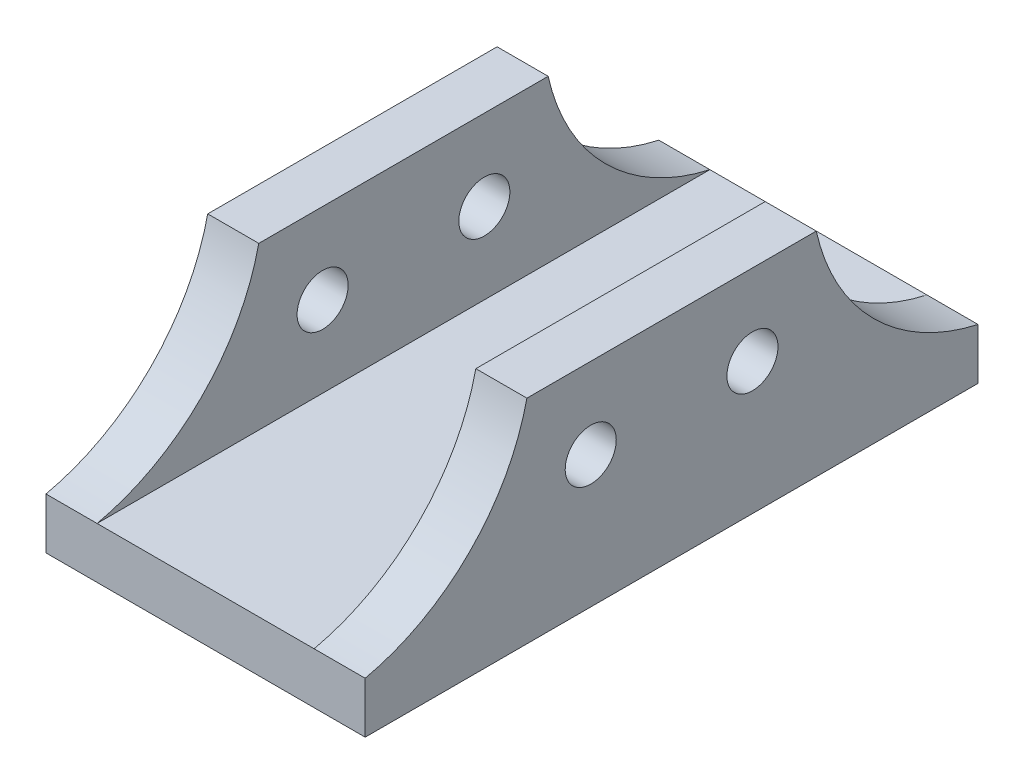
ISO-10303-21;
HEADER;
FILE_DESCRIPTION(('STEP AP214'),'2;1');
FILE_NAME('part.step','',(''),(''),'','','');
FILE_SCHEMA(('AUTOMOTIVE_DESIGN { 1 0 10303 214 1 1 1 1 }'));
ENDSEC;
DATA;
#1=APPLICATION_CONTEXT('core data for automotive mechanical design processes');
#2=APPLICATION_PROTOCOL_DEFINITION('international standard','automotive_design',2000,#1);
#3=PRODUCT_CONTEXT('',#1,'mechanical');
#4=PRODUCT('Part','Part','',(#3));
#5=PRODUCT_RELATED_PRODUCT_CATEGORY('part','',(#4));
#6=PRODUCT_DEFINITION_FORMATION('','',#4);
#7=PRODUCT_DEFINITION_CONTEXT('part definition',#1,'design');
#8=PRODUCT_DEFINITION('design','',#6,#7);
#9=PRODUCT_DEFINITION_SHAPE('','',#8);
#10=(LENGTH_UNIT() NAMED_UNIT(*) SI_UNIT(.MILLI.,.METRE.));
#11=(NAMED_UNIT(*) PLANE_ANGLE_UNIT() SI_UNIT($,.RADIAN.));
#12=(NAMED_UNIT(*) SI_UNIT($,.STERADIAN.) SOLID_ANGLE_UNIT());
#13=UNCERTAINTY_MEASURE_WITH_UNIT(LENGTH_MEASURE(1.E-05),#10,'distance_accuracy_value','');
#14=(GEOMETRIC_REPRESENTATION_CONTEXT(3) GLOBAL_UNCERTAINTY_ASSIGNED_CONTEXT((#13)) GLOBAL_UNIT_ASSIGNED_CONTEXT((#10,
#11,#12)) REPRESENTATION_CONTEXT('',''));
#15=CARTESIAN_POINT('',(0.,0.,0.));
#16=DIRECTION('',(0.,0.,1.));
#17=DIRECTION('',(1.,0.,0.));
#18=AXIS2_PLACEMENT_3D('',#15,#16,#17);
#19=CARTESIAN_POINT('',(37.5,50.,72.));
#20=DIRECTION('',(0.,-1.,0.));
#21=DIRECTION('',(0.,0.,-1.));
#22=AXIS2_PLACEMENT_3D('',#19,#20,#21);
#23=PLANE('',#22);
#24=DIRECTION('',(0.,0.,1.));
#25=VECTOR('',#24,1.);
#26=CARTESIAN_POINT('',(-25.5,50.,-72.));
#27=LINE('',#26,#25);
#28=CARTESIAN_POINT('',(-25.5,50.,-34.));
#29=VERTEX_POINT('',#28);
#30=CARTESIAN_POINT('',(-25.5,50.,34.));
#31=VERTEX_POINT('',#30);
#32=EDGE_CURVE('E133',#29,#31,#27,.T.);
#33=ORIENTED_EDGE('',*,*,#32,.F.);
#34=DIRECTION('',(1.,0.,0.));
#35=VECTOR('',#34,1.);
#36=CARTESIAN_POINT('',(-37.5,50.,-34.));
#37=LINE('',#36,#35);
#38=CARTESIAN_POINT('',(-37.5,50.,-34.));
#39=VERTEX_POINT('',#38);
#40=EDGE_CURVE('E56',#39,#29,#37,.T.);
#41=ORIENTED_EDGE('',*,*,#40,.F.);
#42=DIRECTION('',(0.,0.,1.));
#43=VECTOR('',#42,1.);
#44=CARTESIAN_POINT('',(-37.5,50.,72.));
#45=LINE('',#44,#43);
#46=CARTESIAN_POINT('',(-37.5,50.,34.));
#47=VERTEX_POINT('',#46);
#48=EDGE_CURVE('E131',#39,#47,#45,.T.);
#49=ORIENTED_EDGE('',*,*,#48,.T.);
#50=DIRECTION('',(1.,0.,0.));
#51=VECTOR('',#50,1.);
#52=CARTESIAN_POINT('',(-37.5,50.,34.));
#53=LINE('',#52,#51);
#54=EDGE_CURVE('E225',#47,#31,#53,.T.);
#55=ORIENTED_EDGE('',*,*,#54,.T.);
#56=EDGE_LOOP('',(#33,#41,#49,#55));
#57=FACE_BOUND('',#56,.T.);
#58=ADVANCED_FACE('F39',(#57),#23,.F.);
#59=CARTESIAN_POINT('',(37.5,31.,19.));
#60=DIRECTION('',(-1.,0.,0.));
#61=DIRECTION('',(0.,0.,1.));
#62=AXIS2_PLACEMENT_3D('',#59,#60,#61);
#63=CYLINDRICAL_SURFACE('',#62,6.);
#64=CARTESIAN_POINT('',(-25.5,31.,19.));
#65=DIRECTION('',(-1.,0.,0.));
#66=DIRECTION('',(0.,-1.,0.));
#67=AXIS2_PLACEMENT_3D('',#64,#65,#66);
#68=CIRCLE('',#67,6.);
#69=CARTESIAN_POINT('',(-25.5,25.,19.));
#70=VERTEX_POINT('',#69);
#71=EDGE_CURVE('E176',#70,#70,#68,.T.);
#72=ORIENTED_EDGE('',*,*,#71,.F.);
#73=EDGE_LOOP('',(#72));
#74=FACE_BOUND('',#73,.T.);
#75=CARTESIAN_POINT('',(-37.5,31.,19.));
#76=DIRECTION('',(1.,0.,0.));
#77=DIRECTION('',(0.,0.,-1.));
#78=AXIS2_PLACEMENT_3D('',#75,#76,#77);
#79=CIRCLE('',#78,6.);
#80=CARTESIAN_POINT('',(-37.5,31.,13.));
#81=VERTEX_POINT('',#80);
#82=EDGE_CURVE('E183',#81,#81,#79,.T.);
#83=ORIENTED_EDGE('',*,*,#82,.F.);
#84=EDGE_LOOP('',(#83));
#85=FACE_BOUND('',#84,.T.);
#86=ADVANCED_FACE('F259',(#74,#85),#63,.F.);
#87=CARTESIAN_POINT('',(37.5,31.,-19.));
#88=DIRECTION('',(-1.,0.,0.));
#89=DIRECTION('',(0.,0.,1.));
#90=AXIS2_PLACEMENT_3D('',#87,#88,#89);
#91=CYLINDRICAL_SURFACE('',#90,6.);
#92=CARTESIAN_POINT('',(-25.5,31.,-19.));
#93=DIRECTION('',(-1.,0.,0.));
#94=DIRECTION('',(0.,-1.,0.));
#95=AXIS2_PLACEMENT_3D('',#92,#93,#94);
#96=CIRCLE('',#95,6.);
#97=CARTESIAN_POINT('',(-25.5,25.,-19.));
#98=VERTEX_POINT('',#97);
#99=EDGE_CURVE('E43',#98,#98,#96,.T.);
#100=ORIENTED_EDGE('',*,*,#99,.F.);
#101=EDGE_LOOP('',(#100));
#102=FACE_BOUND('',#101,.T.);
#103=CARTESIAN_POINT('',(-37.5,31.,-19.));
#104=DIRECTION('',(1.,0.,0.));
#105=DIRECTION('',(0.,0.,-1.));
#106=AXIS2_PLACEMENT_3D('',#103,#104,#105);
#107=CIRCLE('',#106,6.);
#108=CARTESIAN_POINT('',(-37.5,31.,-25.));
#109=VERTEX_POINT('',#108);
#110=EDGE_CURVE('E179',#109,#109,#107,.T.);
#111=ORIENTED_EDGE('',*,*,#110,.F.);
#112=EDGE_LOOP('',(#111));
#113=FACE_BOUND('',#112,.T.);
#114=ADVANCED_FACE('F267',(#102,#113),#91,.F.);
#115=CARTESIAN_POINT('',(37.5,0.,0.));
#116=DIRECTION('',(-1.,0.,0.));
#117=DIRECTION('',(0.,0.,1.));
#118=AXIS2_PLACEMENT_3D('',#115,#116,#117);
#119=PLANE('',#118);
#120=DIRECTION('',(0.,1.,0.));
#121=VECTOR('',#120,1.);
#122=CARTESIAN_POINT('',(37.5,0.,-72.));
#123=LINE('',#122,#121);
#124=CARTESIAN_POINT('',(37.5,0.,-72.));
#125=VERTEX_POINT('',#124);
#126=CARTESIAN_POINT('',(37.5,12.,-72.));
#127=VERTEX_POINT('',#126);
#128=EDGE_CURVE('E193',#125,#127,#123,.T.);
#129=ORIENTED_EDGE('',*,*,#128,.T.);
#130=CARTESIAN_POINT('',(37.5,60.8161030317512,-82.8161030317512));
#131=DIRECTION('',(1.,0.,0.));
#132=DIRECTION('',(0.,0.,-1.));
#133=AXIS2_PLACEMENT_3D('',#130,#131,#132);
#134=CIRCLE('',#133,50.);
#135=CARTESIAN_POINT('',(37.5,50.,-34.));
#136=VERTEX_POINT('',#135);
#137=EDGE_CURVE('E125',#136,#127,#134,.T.);
#138=ORIENTED_EDGE('',*,*,#137,.F.);
#139=DIRECTION('',(0.,0.,1.));
#140=VECTOR('',#139,1.);
#141=CARTESIAN_POINT('',(37.5,50.,72.));
#142=LINE('',#141,#140);
#143=CARTESIAN_POINT('',(37.5,50.,34.));
#144=VERTEX_POINT('',#143);
#145=EDGE_CURVE('E151',#136,#144,#142,.T.);
#146=ORIENTED_EDGE('',*,*,#145,.T.);
#147=CARTESIAN_POINT('',(37.5,60.8161030317512,82.8161030317512));
#148=DIRECTION('',(1.,0.,0.));
#149=DIRECTION('',(0.,0.,1.));
#150=AXIS2_PLACEMENT_3D('',#147,#148,#149);
#151=CIRCLE('',#150,50.);
#152=CARTESIAN_POINT('',(37.5,12.,72.));
#153=VERTEX_POINT('',#152);
#154=EDGE_CURVE('E228',#153,#144,#151,.T.);
#155=ORIENTED_EDGE('',*,*,#154,.F.);
#156=DIRECTION('',(0.,-1.,0.));
#157=VECTOR('',#156,1.);
#158=CARTESIAN_POINT('',(37.5,0.,72.));
#159=LINE('',#158,#157);
#160=CARTESIAN_POINT('',(37.5,0.,72.));
#161=VERTEX_POINT('',#160);
#162=EDGE_CURVE('E141',#153,#161,#159,.T.);
#163=ORIENTED_EDGE('',*,*,#162,.T.);
#164=DIRECTION('',(0.,0.,-1.));
#165=VECTOR('',#164,1.);
#166=CARTESIAN_POINT('',(37.5,0.,72.));
#167=LINE('',#166,#165);
#168=EDGE_CURVE('E144',#161,#125,#167,.T.);
#169=ORIENTED_EDGE('',*,*,#168,.T.);
#170=EDGE_LOOP('',(#129,#138,#146,#155,#163,#169));
#171=FACE_BOUND('',#170,.T.);
#172=CARTESIAN_POINT('',(37.5,31.,19.));
#173=DIRECTION('',(1.,0.,0.));
#174=DIRECTION('',(0.,0.,-1.));
#175=AXIS2_PLACEMENT_3D('',#172,#173,#174);
#176=CIRCLE('',#175,6.);
#177=CARTESIAN_POINT('',(37.5,31.,13.));
#178=VERTEX_POINT('',#177);
#179=EDGE_CURVE('E186',#178,#178,#176,.T.);
#180=ORIENTED_EDGE('',*,*,#179,.F.);
#181=EDGE_LOOP('',(#180));
#182=FACE_BOUND('',#181,.T.);
#183=CARTESIAN_POINT('',(37.5,31.,-19.));
#184=DIRECTION('',(1.,0.,0.));
#185=DIRECTION('',(0.,0.,-1.));
#186=AXIS2_PLACEMENT_3D('',#183,#184,#185);
#187=CIRCLE('',#186,6.);
#188=CARTESIAN_POINT('',(37.5,31.,-25.));
#189=VERTEX_POINT('',#188);
#190=EDGE_CURVE('E180',#189,#189,#187,.T.);
#191=ORIENTED_EDGE('',*,*,#190,.F.);
#192=EDGE_LOOP('',(#191));
#193=FACE_BOUND('',#192,.T.);
#194=ADVANCED_FACE('F211',(#171,#182,#193),#119,.F.);
#195=CARTESIAN_POINT('',(-37.5,0.,0.));
#196=DIRECTION('',(-1.,0.,0.));
#197=DIRECTION('',(0.,0.,1.));
#198=AXIS2_PLACEMENT_3D('',#195,#196,#197);
#199=PLANE('',#198);
#200=CARTESIAN_POINT('',(-37.5,60.8161030317512,-82.8161030317512));
#201=DIRECTION('',(1.,0.,0.));
#202=DIRECTION('',(0.,0.,-1.));
#203=AXIS2_PLACEMENT_3D('',#200,#201,#202);
#204=CIRCLE('',#203,50.);
#205=CARTESIAN_POINT('',(-37.5,12.,-72.));
#206=VERTEX_POINT('',#205);
#207=EDGE_CURVE('E116',#39,#206,#204,.T.);
#208=ORIENTED_EDGE('',*,*,#207,.T.);
#209=DIRECTION('',(0.,1.,0.));
#210=VECTOR('',#209,1.);
#211=CARTESIAN_POINT('',(-37.5,0.,-72.));
#212=LINE('',#211,#210);
#213=CARTESIAN_POINT('',(-37.5,0.,-72.));
#214=VERTEX_POINT('',#213);
#215=EDGE_CURVE('E142',#214,#206,#212,.T.);
#216=ORIENTED_EDGE('',*,*,#215,.F.);
#217=DIRECTION('',(0.,0.,-1.));
#218=VECTOR('',#217,1.);
#219=CARTESIAN_POINT('',(-37.5,0.,72.));
#220=LINE('',#219,#218);
#221=CARTESIAN_POINT('',(-37.5,0.,72.));
#222=VERTEX_POINT('',#221);
#223=EDGE_CURVE('E146',#222,#214,#220,.T.);
#224=ORIENTED_EDGE('',*,*,#223,.F.);
#225=DIRECTION('',(0.,-1.,0.));
#226=VECTOR('',#225,1.);
#227=CARTESIAN_POINT('',(-37.5,0.,72.));
#228=LINE('',#227,#226);
#229=CARTESIAN_POINT('',(-37.5,12.,72.));
#230=VERTEX_POINT('',#229);
#231=EDGE_CURVE('E189',#230,#222,#228,.T.);
#232=ORIENTED_EDGE('',*,*,#231,.F.);
#233=CARTESIAN_POINT('',(-37.5,60.8161030317512,82.8161030317512));
#234=DIRECTION('',(1.,0.,0.));
#235=DIRECTION('',(0.,0.,1.));
#236=AXIS2_PLACEMENT_3D('',#233,#234,#235);
#237=CIRCLE('',#236,50.);
#238=EDGE_CURVE('E140',#230,#47,#237,.T.);
#239=ORIENTED_EDGE('',*,*,#238,.T.);
#240=ORIENTED_EDGE('',*,*,#48,.F.);
#241=EDGE_LOOP('',(#208,#216,#224,#232,#239,#240));
#242=FACE_BOUND('',#241,.T.);
#243=ORIENTED_EDGE('',*,*,#82,.T.);
#244=EDGE_LOOP('',(#243));
#245=FACE_BOUND('',#244,.T.);
#246=ORIENTED_EDGE('',*,*,#110,.T.);
#247=EDGE_LOOP('',(#246));
#248=FACE_BOUND('',#247,.T.);
#249=ADVANCED_FACE('F137',(#242,#245,#248),#199,.T.);
#250=CARTESIAN_POINT('',(37.5,0.,72.));
#251=DIRECTION('',(0.,0.,-1.));
#252=DIRECTION('',(-1.,0.,0.));
#253=AXIS2_PLACEMENT_3D('',#250,#251,#252);
#254=PLANE('',#253);
#255=ORIENTED_EDGE('',*,*,#162,.F.);
#256=DIRECTION('',(1.,0.,0.));
#257=VECTOR('',#256,1.);
#258=CARTESIAN_POINT('',(-37.5,12.,72.));
#259=LINE('',#258,#257);
#260=CARTESIAN_POINT('',(25.5,12.,72.));
#261=VERTEX_POINT('',#260);
#262=EDGE_CURVE('E223',#261,#153,#259,.T.);
#263=ORIENTED_EDGE('',*,*,#262,.F.);
#264=DIRECTION('',(1.,0.,0.));
#265=VECTOR('',#264,1.);
#266=CARTESIAN_POINT('',(-25.5,12.,72.));
#267=LINE('',#266,#265);
#268=CARTESIAN_POINT('',(-25.5,12.,72.));
#269=VERTEX_POINT('',#268);
#270=EDGE_CURVE('E167',#269,#261,#267,.T.);
#271=ORIENTED_EDGE('',*,*,#270,.F.);
#272=EDGE_CURVE('E220',#230,#269,#259,.T.);
#273=ORIENTED_EDGE('',*,*,#272,.F.);
#274=ORIENTED_EDGE('',*,*,#231,.T.);
#275=DIRECTION('',(-1.,0.,0.));
#276=VECTOR('',#275,1.);
#277=CARTESIAN_POINT('',(37.5,0.,72.));
#278=LINE('',#277,#276);
#279=EDGE_CURVE('E11',#161,#222,#278,.T.);
#280=ORIENTED_EDGE('',*,*,#279,.F.);
#281=EDGE_LOOP('',(#255,#263,#271,#273,#274,#280));
#282=FACE_BOUND('',#281,.T.);
#283=ADVANCED_FACE('F41',(#282),#254,.F.);
#284=CARTESIAN_POINT('',(37.5,0.,72.));
#285=DIRECTION('',(0.,1.,0.));
#286=DIRECTION('',(0.,0.,1.));
#287=AXIS2_PLACEMENT_3D('',#284,#285,#286);
#288=PLANE('',#287);
#289=ORIENTED_EDGE('',*,*,#223,.T.);
#290=DIRECTION('',(-1.,0.,0.));
#291=VECTOR('',#290,1.);
#292=CARTESIAN_POINT('',(37.5,0.,-72.));
#293=LINE('',#292,#291);
#294=EDGE_CURVE('E48',#125,#214,#293,.T.);
#295=ORIENTED_EDGE('',*,*,#294,.F.);
#296=ORIENTED_EDGE('',*,*,#168,.F.);
#297=ORIENTED_EDGE('',*,*,#279,.T.);
#298=EDGE_LOOP('',(#289,#295,#296,#297));
#299=FACE_BOUND('',#298,.T.);
#300=ADVANCED_FACE('F201',(#299),#288,.F.);
#301=CARTESIAN_POINT('',(37.5,0.,-72.));
#302=DIRECTION('',(0.,0.,1.));
#303=DIRECTION('',(1.,0.,0.));
#304=AXIS2_PLACEMENT_3D('',#301,#302,#303);
#305=PLANE('',#304);
#306=ORIENTED_EDGE('',*,*,#215,.T.);
#307=DIRECTION('',(1.,0.,0.));
#308=VECTOR('',#307,1.);
#309=CARTESIAN_POINT('',(-37.5,12.,-72.));
#310=LINE('',#309,#308);
#311=CARTESIAN_POINT('',(-25.5,12.,-72.));
#312=VERTEX_POINT('',#311);
#313=EDGE_CURVE('E119',#206,#312,#310,.T.);
#314=ORIENTED_EDGE('',*,*,#313,.T.);
#315=DIRECTION('',(1.,0.,0.));
#316=VECTOR('',#315,1.);
#317=CARTESIAN_POINT('',(-25.5,12.,-72.));
#318=LINE('',#317,#316);
#319=CARTESIAN_POINT('',(25.5,12.,-72.));
#320=VERTEX_POINT('',#319);
#321=EDGE_CURVE('E174',#312,#320,#318,.T.);
#322=ORIENTED_EDGE('',*,*,#321,.T.);
#323=EDGE_CURVE('E134',#320,#127,#310,.T.);
#324=ORIENTED_EDGE('',*,*,#323,.T.);
#325=ORIENTED_EDGE('',*,*,#128,.F.);
#326=ORIENTED_EDGE('',*,*,#294,.T.);
#327=EDGE_LOOP('',(#306,#314,#322,#324,#325,#326));
#328=FACE_BOUND('',#327,.T.);
#329=ADVANCED_FACE('F206',(#328),#305,.F.);
#330=ORIENTED_EDGE('',*,*,#145,.F.);
#331=CARTESIAN_POINT('',(25.5,50.,-34.));
#332=VERTEX_POINT('',#331);
#333=EDGE_CURVE('E124',#332,#136,#37,.T.);
#334=ORIENTED_EDGE('',*,*,#333,.F.);
#335=DIRECTION('',(0.,0.,1.));
#336=VECTOR('',#335,1.);
#337=CARTESIAN_POINT('',(25.5,50.,-72.));
#338=LINE('',#337,#336);
#339=CARTESIAN_POINT('',(25.5,50.,34.));
#340=VERTEX_POINT('',#339);
#341=EDGE_CURVE('E159',#332,#340,#338,.T.);
#342=ORIENTED_EDGE('',*,*,#341,.T.);
#343=EDGE_CURVE('E64',#340,#144,#53,.T.);
#344=ORIENTED_EDGE('',*,*,#343,.T.);
#345=EDGE_LOOP('',(#330,#334,#342,#344));
#346=FACE_BOUND('',#345,.T.);
#347=ADVANCED_FACE('F261',(#346),#23,.F.);
#348=CARTESIAN_POINT('',(25.5,31.,19.));
#349=DIRECTION('',(1.,0.,0.));
#350=DIRECTION('',(0.,1.,0.));
#351=AXIS2_PLACEMENT_3D('',#348,#349,#350);
#352=CIRCLE('',#351,6.);
#353=CARTESIAN_POINT('',(25.5,37.,19.));
#354=VERTEX_POINT('',#353);
#355=EDGE_CURVE('E154',#354,#354,#352,.T.);
#356=ORIENTED_EDGE('',*,*,#355,.F.);
#357=EDGE_LOOP('',(#356));
#358=FACE_BOUND('',#357,.T.);
#359=ORIENTED_EDGE('',*,*,#179,.T.);
#360=EDGE_LOOP('',(#359));
#361=FACE_BOUND('',#360,.T.);
#362=ADVANCED_FACE('F270',(#358,#361),#63,.F.);
#363=CARTESIAN_POINT('',(25.5,31.,-19.));
#364=DIRECTION('',(1.,0.,0.));
#365=DIRECTION('',(0.,1.,0.));
#366=AXIS2_PLACEMENT_3D('',#363,#364,#365);
#367=CIRCLE('',#366,6.);
#368=CARTESIAN_POINT('',(25.5,37.,-19.));
#369=VERTEX_POINT('',#368);
#370=EDGE_CURVE('E152',#369,#369,#367,.T.);
#371=ORIENTED_EDGE('',*,*,#370,.F.);
#372=EDGE_LOOP('',(#371));
#373=FACE_BOUND('',#372,.T.);
#374=ORIENTED_EDGE('',*,*,#190,.T.);
#375=EDGE_LOOP('',(#374));
#376=FACE_BOUND('',#375,.T.);
#377=ADVANCED_FACE('F280',(#373,#376),#91,.F.);
#378=CARTESIAN_POINT('',(-25.5,50.,-72.));
#379=DIRECTION('',(-1.,0.,0.));
#380=DIRECTION('',(0.,-1.,0.));
#381=AXIS2_PLACEMENT_3D('',#378,#379,#380);
#382=PLANE('',#381);
#383=ORIENTED_EDGE('',*,*,#71,.T.);
#384=EDGE_LOOP('',(#383));
#385=FACE_BOUND('',#384,.T.);
#386=ORIENTED_EDGE('',*,*,#99,.T.);
#387=EDGE_LOOP('',(#386));
#388=FACE_BOUND('',#387,.T.);
#389=DIRECTION('',(0.,0.,1.));
#390=VECTOR('',#389,1.);
#391=CARTESIAN_POINT('',(-25.5,12.,-72.));
#392=LINE('',#391,#390);
#393=EDGE_CURVE('E172',#312,#269,#392,.T.);
#394=ORIENTED_EDGE('',*,*,#393,.F.);
#395=CARTESIAN_POINT('',(-25.5,60.8161030317512,-82.8161030317512));
#396=DIRECTION('',(-1.,0.,0.));
#397=DIRECTION('',(0.,-1.,0.));
#398=AXIS2_PLACEMENT_3D('',#395,#396,#397);
#399=CIRCLE('',#398,50.);
#400=EDGE_CURVE('E238',#312,#29,#399,.T.);
#401=ORIENTED_EDGE('',*,*,#400,.T.);
#402=ORIENTED_EDGE('',*,*,#32,.T.);
#403=CARTESIAN_POINT('',(-25.5,60.8161030317512,82.8161030317512));
#404=DIRECTION('',(-1.,0.,0.));
#405=DIRECTION('',(0.,-1.,0.));
#406=AXIS2_PLACEMENT_3D('',#403,#404,#405);
#407=CIRCLE('',#406,50.);
#408=EDGE_CURVE('E233',#31,#269,#407,.T.);
#409=ORIENTED_EDGE('',*,*,#408,.T.);
#410=EDGE_LOOP('',(#394,#401,#402,#409));
#411=FACE_BOUND('',#410,.T.);
#412=ADVANCED_FACE('F244',(#385,#388,#411),#382,.F.);
#413=CARTESIAN_POINT('',(25.5,50.,-72.));
#414=DIRECTION('',(1.,0.,0.));
#415=DIRECTION('',(0.,1.,0.));
#416=AXIS2_PLACEMENT_3D('',#413,#414,#415);
#417=PLANE('',#416);
#418=ORIENTED_EDGE('',*,*,#355,.T.);
#419=EDGE_LOOP('',(#418));
#420=FACE_BOUND('',#419,.T.);
#421=ORIENTED_EDGE('',*,*,#370,.T.);
#422=EDGE_LOOP('',(#421));
#423=FACE_BOUND('',#422,.T.);
#424=ORIENTED_EDGE('',*,*,#341,.F.);
#425=CARTESIAN_POINT('',(25.5,60.8161030317512,-82.8161030317512));
#426=DIRECTION('',(1.,0.,0.));
#427=DIRECTION('',(0.,1.,0.));
#428=AXIS2_PLACEMENT_3D('',#425,#426,#427);
#429=CIRCLE('',#428,50.);
#430=EDGE_CURVE('E235',#332,#320,#429,.T.);
#431=ORIENTED_EDGE('',*,*,#430,.T.);
#432=DIRECTION('',(0.,0.,1.));
#433=VECTOR('',#432,1.);
#434=CARTESIAN_POINT('',(25.5,12.,-72.));
#435=LINE('',#434,#433);
#436=EDGE_CURVE('E164',#320,#261,#435,.T.);
#437=ORIENTED_EDGE('',*,*,#436,.T.);
#438=CARTESIAN_POINT('',(25.5,60.8161030317512,82.8161030317512));
#439=DIRECTION('',(1.,0.,0.));
#440=DIRECTION('',(0.,1.,0.));
#441=AXIS2_PLACEMENT_3D('',#438,#439,#440);
#442=CIRCLE('',#441,50.);
#443=EDGE_CURVE('E231',#261,#340,#442,.T.);
#444=ORIENTED_EDGE('',*,*,#443,.T.);
#445=EDGE_LOOP('',(#424,#431,#437,#444));
#446=FACE_BOUND('',#445,.T.);
#447=ADVANCED_FACE('F285',(#420,#423,#446),#417,.F.);
#448=CARTESIAN_POINT('',(-25.5,12.,-72.));
#449=DIRECTION('',(0.,-1.,0.));
#450=DIRECTION('',(0.,0.,-1.));
#451=AXIS2_PLACEMENT_3D('',#448,#449,#450);
#452=PLANE('',#451);
#453=ORIENTED_EDGE('',*,*,#270,.T.);
#454=ORIENTED_EDGE('',*,*,#436,.F.);
#455=ORIENTED_EDGE('',*,*,#321,.F.);
#456=ORIENTED_EDGE('',*,*,#393,.T.);
#457=EDGE_LOOP('',(#453,#454,#455,#456));
#458=FACE_BOUND('',#457,.T.);
#459=ADVANCED_FACE('F242',(#458),#452,.F.);
#460=CARTESIAN_POINT('',(-37.5,60.8161030317512,82.8161030317512));
#461=DIRECTION('',(1.,0.,0.));
#462=DIRECTION('',(0.,0.,-1.));
#463=AXIS2_PLACEMENT_3D('',#460,#461,#462);
#464=CYLINDRICAL_SURFACE('',#463,50.);
#465=ORIENTED_EDGE('',*,*,#262,.T.);
#466=ORIENTED_EDGE('',*,*,#154,.T.);
#467=ORIENTED_EDGE('',*,*,#343,.F.);
#468=ORIENTED_EDGE('',*,*,#443,.F.);
#469=EDGE_LOOP('',(#465,#466,#467,#468));
#470=FACE_BOUND('',#469,.T.);
#471=ADVANCED_FACE('F249',(#470),#464,.F.);
#472=CARTESIAN_POINT('',(-37.5,60.8161030317512,-82.8161030317512));
#473=DIRECTION('',(1.,0.,0.));
#474=DIRECTION('',(0.,0.,-1.));
#475=AXIS2_PLACEMENT_3D('',#472,#473,#474);
#476=CYLINDRICAL_SURFACE('',#475,50.);
#477=ORIENTED_EDGE('',*,*,#333,.T.);
#478=ORIENTED_EDGE('',*,*,#137,.T.);
#479=ORIENTED_EDGE('',*,*,#323,.F.);
#480=ORIENTED_EDGE('',*,*,#430,.F.);
#481=EDGE_LOOP('',(#477,#478,#479,#480));
#482=FACE_BOUND('',#481,.T.);
#483=ADVANCED_FACE('F247',(#482),#476,.F.);
#484=ORIENTED_EDGE('',*,*,#54,.F.);
#485=ORIENTED_EDGE('',*,*,#238,.F.);
#486=ORIENTED_EDGE('',*,*,#272,.T.);
#487=ORIENTED_EDGE('',*,*,#408,.F.);
#488=EDGE_LOOP('',(#484,#485,#486,#487));
#489=FACE_BOUND('',#488,.T.);
#490=ADVANCED_FACE('F245',(#489),#464,.F.);
#491=ORIENTED_EDGE('',*,*,#313,.F.);
#492=ORIENTED_EDGE('',*,*,#207,.F.);
#493=ORIENTED_EDGE('',*,*,#40,.T.);
#494=ORIENTED_EDGE('',*,*,#400,.F.);
#495=EDGE_LOOP('',(#491,#492,#493,#494));
#496=FACE_BOUND('',#495,.T.);
#497=ADVANCED_FACE('F117',(#496),#476,.F.);
#498=CLOSED_SHELL('',(#58,#86,#114,#194,#249,#283,#300,#329,#347,#362,#377,#412,#447,#459,#471,
#483,#490,#497));
#499=MANIFOLD_SOLID_BREP('B2',#498);
#500=ADVANCED_BREP_SHAPE_REPRESENTATION('',(#18,#499),#14);
#501=SHAPE_DEFINITION_REPRESENTATION(#9,#500);
ENDSEC;
END-ISO-10303-21;
